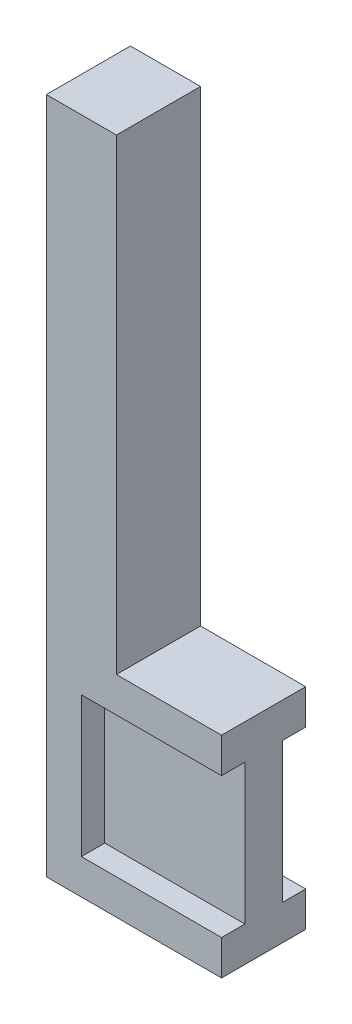
ISO-10303-21;
HEADER;
FILE_DESCRIPTION(('STEP AP214'),'2;1');
FILE_NAME('part.step','',(''),(''),'','','');
FILE_SCHEMA(('AUTOMOTIVE_DESIGN { 1 0 10303 214 1 1 1 1 }'));
ENDSEC;
DATA;
#1=APPLICATION_CONTEXT('core data for automotive mechanical design processes');
#2=APPLICATION_PROTOCOL_DEFINITION('international standard','automotive_design',2000,#1);
#3=PRODUCT_CONTEXT('',#1,'mechanical');
#4=PRODUCT('Part','Part','',(#3));
#5=PRODUCT_RELATED_PRODUCT_CATEGORY('part','',(#4));
#6=PRODUCT_DEFINITION_FORMATION('','',#4);
#7=PRODUCT_DEFINITION_CONTEXT('part definition',#1,'design');
#8=PRODUCT_DEFINITION('design','',#6,#7);
#9=PRODUCT_DEFINITION_SHAPE('','',#8);
#10=(LENGTH_UNIT() NAMED_UNIT(*) SI_UNIT(.MILLI.,.METRE.));
#11=(NAMED_UNIT(*) PLANE_ANGLE_UNIT() SI_UNIT($,.RADIAN.));
#12=(NAMED_UNIT(*) SI_UNIT($,.STERADIAN.) SOLID_ANGLE_UNIT());
#13=UNCERTAINTY_MEASURE_WITH_UNIT(LENGTH_MEASURE(1.E-05),#10,'distance_accuracy_value','');
#14=(GEOMETRIC_REPRESENTATION_CONTEXT(3) GLOBAL_UNCERTAINTY_ASSIGNED_CONTEXT((#13)) GLOBAL_UNIT_ASSIGNED_CONTEXT((#10,
#11,#12)) REPRESENTATION_CONTEXT('',''));
#15=CARTESIAN_POINT('',(0.,0.,0.));
#16=DIRECTION('',(0.,0.,1.));
#17=DIRECTION('',(1.,0.,0.));
#18=AXIS2_PLACEMENT_3D('',#15,#16,#17);
#19=CARTESIAN_POINT('',(0.,7.5,-1.));
#20=DIRECTION('',(0.,-1.,0.));
#21=DIRECTION('',(0.,0.,-1.));
#22=AXIS2_PLACEMENT_3D('',#19,#20,#21);
#23=PLANE('',#22);
#24=DIRECTION('',(0.,0.,-1.));
#25=VECTOR('',#24,1.);
#26=CARTESIAN_POINT('',(1.5,7.5,-1.));
#27=LINE('',#26,#25);
#28=CARTESIAN_POINT('',(1.5,7.5,2.6));
#29=VERTEX_POINT('',#28);
#30=CARTESIAN_POINT('',(1.5,7.5,-1.));
#31=VERTEX_POINT('',#30);
#32=EDGE_CURVE('E57',#29,#31,#27,.T.);
#33=ORIENTED_EDGE('',*,*,#32,.F.);
#34=DIRECTION('',(1.,0.,0.));
#35=VECTOR('',#34,1.);
#36=CARTESIAN_POINT('',(0.,7.5,2.6));
#37=LINE('',#36,#35);
#38=CARTESIAN_POINT('',(6.,7.5,2.6));
#39=VERTEX_POINT('',#38);
#40=EDGE_CURVE('E160',#29,#39,#37,.T.);
#41=ORIENTED_EDGE('',*,*,#40,.T.);
#42=DIRECTION('',(0.,0.,1.));
#43=VECTOR('',#42,1.);
#44=CARTESIAN_POINT('',(6.,7.5,-1.));
#45=LINE('',#44,#43);
#46=CARTESIAN_POINT('',(6.,7.5,-1.));
#47=VERTEX_POINT('',#46);
#48=EDGE_CURVE('E236',#47,#39,#45,.T.);
#49=ORIENTED_EDGE('',*,*,#48,.F.);
#50=DIRECTION('',(1.,0.,0.));
#51=VECTOR('',#50,1.);
#52=CARTESIAN_POINT('',(0.,7.5,-1.));
#53=LINE('',#52,#51);
#54=EDGE_CURVE('E208',#31,#47,#53,.T.);
#55=ORIENTED_EDGE('',*,*,#54,.F.);
#56=EDGE_LOOP('',(#33,#41,#49,#55));
#57=FACE_BOUND('',#56,.T.);
#58=ADVANCED_FACE('F40',(#57),#23,.F.);
#59=CARTESIAN_POINT('',(6.,0.,1.6));
#60=DIRECTION('',(-1.,0.,0.));
#61=DIRECTION('',(0.,0.,1.));
#62=AXIS2_PLACEMENT_3D('',#59,#60,#61);
#63=PLANE('',#62);
#64=DIRECTION('',(0.,1.,0.));
#65=VECTOR('',#64,1.);
#66=CARTESIAN_POINT('',(6.,0.,0.));
#67=LINE('',#66,#65);
#68=CARTESIAN_POINT('',(6.,0.,0.));
#69=VERTEX_POINT('',#68);
#70=CARTESIAN_POINT('',(6.,6.,0.));
#71=VERTEX_POINT('',#70);
#72=EDGE_CURVE('E249',#69,#71,#67,.T.);
#73=ORIENTED_EDGE('',*,*,#72,.T.);
#74=DIRECTION('',(0.,0.,1.));
#75=VECTOR('',#74,1.);
#76=CARTESIAN_POINT('',(6.,6.,-1.));
#77=LINE('',#76,#75);
#78=CARTESIAN_POINT('',(6.,6.,-1.));
#79=VERTEX_POINT('',#78);
#80=EDGE_CURVE('E239',#79,#71,#77,.T.);
#81=ORIENTED_EDGE('',*,*,#80,.F.);
#82=DIRECTION('',(0.,1.,0.));
#83=VECTOR('',#82,1.);
#84=CARTESIAN_POINT('',(6.,0.,-1.));
#85=LINE('',#84,#83);
#86=EDGE_CURVE('E205',#79,#47,#85,.T.);
#87=ORIENTED_EDGE('',*,*,#86,.T.);
#88=ORIENTED_EDGE('',*,*,#48,.T.);
#89=DIRECTION('',(0.,1.,0.));
#90=VECTOR('',#89,1.);
#91=CARTESIAN_POINT('',(6.,0.,2.6));
#92=LINE('',#91,#90);
#93=CARTESIAN_POINT('',(6.,6.,2.6));
#94=VERTEX_POINT('',#93);
#95=EDGE_CURVE('E188',#94,#39,#92,.T.);
#96=ORIENTED_EDGE('',*,*,#95,.F.);
#97=CARTESIAN_POINT('',(6.,6.,1.6));
#98=VERTEX_POINT('',#97);
#99=EDGE_CURVE('E220',#98,#94,#77,.T.);
#100=ORIENTED_EDGE('',*,*,#99,.F.);
#101=DIRECTION('',(0.,1.,0.));
#102=VECTOR('',#101,1.);
#103=CARTESIAN_POINT('',(6.,0.,1.6));
#104=LINE('',#103,#102);
#105=CARTESIAN_POINT('',(6.,0.,1.6));
#106=VERTEX_POINT('',#105);
#107=EDGE_CURVE('E49',#106,#98,#104,.T.);
#108=ORIENTED_EDGE('',*,*,#107,.F.);
#109=DIRECTION('',(0.,0.,1.));
#110=VECTOR('',#109,1.);
#111=CARTESIAN_POINT('',(6.,0.,-1.));
#112=LINE('',#111,#110);
#113=CARTESIAN_POINT('',(6.,0.,2.6));
#114=VERTEX_POINT('',#113);
#115=EDGE_CURVE('E232',#106,#114,#112,.T.);
#116=ORIENTED_EDGE('',*,*,#115,.T.);
#117=DIRECTION('',(0.,-1.,0.));
#118=VECTOR('',#117,1.);
#119=CARTESIAN_POINT('',(6.,0.,2.6));
#120=LINE('',#119,#118);
#121=CARTESIAN_POINT('',(6.,-1.5,2.6));
#122=VERTEX_POINT('',#121);
#123=EDGE_CURVE('E193',#114,#122,#120,.T.);
#124=ORIENTED_EDGE('',*,*,#123,.T.);
#125=DIRECTION('',(0.,0.,1.));
#126=VECTOR('',#125,1.);
#127=CARTESIAN_POINT('',(6.,-1.5,-1.));
#128=LINE('',#127,#126);
#129=CARTESIAN_POINT('',(6.,-1.5,-1.));
#130=VERTEX_POINT('',#129);
#131=EDGE_CURVE('E233',#130,#122,#128,.T.);
#132=ORIENTED_EDGE('',*,*,#131,.F.);
#133=DIRECTION('',(0.,-1.,0.));
#134=VECTOR('',#133,1.);
#135=CARTESIAN_POINT('',(6.,0.,-1.));
#136=LINE('',#135,#134);
#137=CARTESIAN_POINT('',(6.,0.,-1.));
#138=VERTEX_POINT('',#137);
#139=EDGE_CURVE('E214',#138,#130,#136,.T.);
#140=ORIENTED_EDGE('',*,*,#139,.F.);
#141=EDGE_CURVE('E229',#138,#69,#112,.T.);
#142=ORIENTED_EDGE('',*,*,#141,.T.);
#143=EDGE_LOOP('',(#73,#81,#87,#88,#96,#100,#108,#116,#124,#132,#140,#142));
#144=FACE_BOUND('',#143,.T.);
#145=ADVANCED_FACE('F42',(#144),#63,.F.);
#146=CARTESIAN_POINT('',(0.,0.,1.6));
#147=DIRECTION('',(0.,0.,-1.));
#148=DIRECTION('',(-1.,0.,0.));
#149=AXIS2_PLACEMENT_3D('',#146,#147,#148);
#150=PLANE('',#149);
#151=DIRECTION('',(0.,-1.,0.));
#152=VECTOR('',#151,1.);
#153=CARTESIAN_POINT('',(0.,0.,1.6));
#154=LINE('',#153,#152);
#155=CARTESIAN_POINT('',(0.,6.,1.6));
#156=VERTEX_POINT('',#155);
#157=CARTESIAN_POINT('',(0.,0.,1.6));
#158=VERTEX_POINT('',#157);
#159=EDGE_CURVE('E86',#156,#158,#154,.T.);
#160=ORIENTED_EDGE('',*,*,#159,.T.);
#161=DIRECTION('',(1.,0.,0.));
#162=VECTOR('',#161,1.);
#163=CARTESIAN_POINT('',(0.,0.,1.6));
#164=LINE('',#163,#162);
#165=EDGE_CURVE('E243',#158,#106,#164,.T.);
#166=ORIENTED_EDGE('',*,*,#165,.T.);
#167=ORIENTED_EDGE('',*,*,#107,.T.);
#168=DIRECTION('',(-1.,0.,0.));
#169=VECTOR('',#168,1.);
#170=CARTESIAN_POINT('',(0.,6.,1.6));
#171=LINE('',#170,#169);
#172=EDGE_CURVE('E11',#98,#156,#171,.T.);
#173=ORIENTED_EDGE('',*,*,#172,.T.);
#174=EDGE_LOOP('',(#160,#166,#167,#173));
#175=FACE_BOUND('',#174,.T.);
#176=ADVANCED_FACE('F295',(#175),#150,.F.);
#177=CARTESIAN_POINT('',(0.,0.,0.));
#178=DIRECTION('',(0.,0.,-1.));
#179=DIRECTION('',(-1.,0.,0.));
#180=AXIS2_PLACEMENT_3D('',#177,#178,#179);
#181=PLANE('',#180);
#182=DIRECTION('',(0.,-1.,0.));
#183=VECTOR('',#182,1.);
#184=CARTESIAN_POINT('',(0.,0.,0.));
#185=LINE('',#184,#183);
#186=CARTESIAN_POINT('',(0.,6.,0.));
#187=VERTEX_POINT('',#186);
#188=CARTESIAN_POINT('',(0.,0.,0.));
#189=VERTEX_POINT('',#188);
#190=EDGE_CURVE('E82',#187,#189,#185,.T.);
#191=ORIENTED_EDGE('',*,*,#190,.F.);
#192=DIRECTION('',(-1.,0.,0.));
#193=VECTOR('',#192,1.);
#194=CARTESIAN_POINT('',(0.,6.,0.));
#195=LINE('',#194,#193);
#196=EDGE_CURVE('E44',#71,#187,#195,.T.);
#197=ORIENTED_EDGE('',*,*,#196,.F.);
#198=ORIENTED_EDGE('',*,*,#72,.F.);
#199=DIRECTION('',(1.,0.,0.));
#200=VECTOR('',#199,1.);
#201=CARTESIAN_POINT('',(0.,0.,0.));
#202=LINE('',#201,#200);
#203=EDGE_CURVE('E247',#189,#69,#202,.T.);
#204=ORIENTED_EDGE('',*,*,#203,.F.);
#205=EDGE_LOOP('',(#191,#197,#198,#204));
#206=FACE_BOUND('',#205,.T.);
#207=ADVANCED_FACE('F286',(#206),#181,.T.);
#208=CARTESIAN_POINT('',(0.,6.,-1.));
#209=DIRECTION('',(0.,1.,0.));
#210=DIRECTION('',(0.,0.,1.));
#211=AXIS2_PLACEMENT_3D('',#208,#209,#210);
#212=PLANE('',#211);
#213=DIRECTION('',(0.,0.,1.));
#214=VECTOR('',#213,1.);
#215=CARTESIAN_POINT('',(0.,6.,-1.));
#216=LINE('',#215,#214);
#217=CARTESIAN_POINT('',(0.,6.,2.6));
#218=VERTEX_POINT('',#217);
#219=EDGE_CURVE('E224',#156,#218,#216,.T.);
#220=ORIENTED_EDGE('',*,*,#219,.F.);
#221=ORIENTED_EDGE('',*,*,#172,.F.);
#222=ORIENTED_EDGE('',*,*,#99,.T.);
#223=DIRECTION('',(-1.,0.,0.));
#224=VECTOR('',#223,1.);
#225=CARTESIAN_POINT('',(0.,6.,2.6));
#226=LINE('',#225,#224);
#227=EDGE_CURVE('E185',#94,#218,#226,.T.);
#228=ORIENTED_EDGE('',*,*,#227,.T.);
#229=EDGE_LOOP('',(#220,#221,#222,#228));
#230=FACE_BOUND('',#229,.T.);
#231=ADVANCED_FACE('F269',(#230),#212,.F.);
#232=CARTESIAN_POINT('',(0.,0.,-1.));
#233=DIRECTION('',(-1.,0.,0.));
#234=DIRECTION('',(0.,-1.,0.));
#235=AXIS2_PLACEMENT_3D('',#232,#233,#234);
#236=PLANE('',#235);
#237=DIRECTION('',(0.,0.,1.));
#238=VECTOR('',#237,1.);
#239=CARTESIAN_POINT('',(0.,0.,-1.));
#240=LINE('',#239,#238);
#241=CARTESIAN_POINT('',(0.,0.,2.6));
#242=VERTEX_POINT('',#241);
#243=EDGE_CURVE('E228',#158,#242,#240,.T.);
#244=ORIENTED_EDGE('',*,*,#243,.F.);
#245=ORIENTED_EDGE('',*,*,#159,.F.);
#246=ORIENTED_EDGE('',*,*,#219,.T.);
#247=DIRECTION('',(0.,-1.,0.));
#248=VECTOR('',#247,1.);
#249=CARTESIAN_POINT('',(0.,0.,2.6));
#250=LINE('',#249,#248);
#251=EDGE_CURVE('E199',#218,#242,#250,.T.);
#252=ORIENTED_EDGE('',*,*,#251,.T.);
#253=EDGE_LOOP('',(#244,#245,#246,#252));
#254=FACE_BOUND('',#253,.T.);
#255=ADVANCED_FACE('F277',(#254),#236,.F.);
#256=CARTESIAN_POINT('',(0.,0.,-1.));
#257=DIRECTION('',(0.,-1.,0.));
#258=DIRECTION('',(0.,0.,-1.));
#259=AXIS2_PLACEMENT_3D('',#256,#257,#258);
#260=PLANE('',#259);
#261=ORIENTED_EDGE('',*,*,#115,.F.);
#262=ORIENTED_EDGE('',*,*,#165,.F.);
#263=ORIENTED_EDGE('',*,*,#243,.T.);
#264=DIRECTION('',(1.,0.,0.));
#265=VECTOR('',#264,1.);
#266=CARTESIAN_POINT('',(0.,0.,2.6));
#267=LINE('',#266,#265);
#268=EDGE_CURVE('E196',#242,#114,#267,.T.);
#269=ORIENTED_EDGE('',*,*,#268,.T.);
#270=EDGE_LOOP('',(#261,#262,#263,#269));
#271=FACE_BOUND('',#270,.T.);
#272=ADVANCED_FACE('F274',(#271),#260,.F.);
#273=ORIENTED_EDGE('',*,*,#196,.T.);
#274=CARTESIAN_POINT('',(0.,6.,-1.));
#275=VERTEX_POINT('',#274);
#276=EDGE_CURVE('E221',#275,#187,#216,.T.);
#277=ORIENTED_EDGE('',*,*,#276,.F.);
#278=DIRECTION('',(-1.,0.,0.));
#279=VECTOR('',#278,1.);
#280=CARTESIAN_POINT('',(0.,6.,-1.));
#281=LINE('',#280,#279);
#282=EDGE_CURVE('E202',#79,#275,#281,.T.);
#283=ORIENTED_EDGE('',*,*,#282,.F.);
#284=ORIENTED_EDGE('',*,*,#80,.T.);
#285=EDGE_LOOP('',(#273,#277,#283,#284));
#286=FACE_BOUND('',#285,.T.);
#287=ADVANCED_FACE('F253',(#286),#212,.F.);
#288=ORIENTED_EDGE('',*,*,#190,.T.);
#289=CARTESIAN_POINT('',(0.,0.,-1.));
#290=VERTEX_POINT('',#289);
#291=EDGE_CURVE('E225',#290,#189,#240,.T.);
#292=ORIENTED_EDGE('',*,*,#291,.F.);
#293=DIRECTION('',(0.,-1.,0.));
#294=VECTOR('',#293,1.);
#295=CARTESIAN_POINT('',(0.,0.,-1.));
#296=LINE('',#295,#294);
#297=EDGE_CURVE('E218',#275,#290,#296,.T.);
#298=ORIENTED_EDGE('',*,*,#297,.F.);
#299=ORIENTED_EDGE('',*,*,#276,.T.);
#300=EDGE_LOOP('',(#288,#292,#298,#299));
#301=FACE_BOUND('',#300,.T.);
#302=ADVANCED_FACE('F256',(#301),#236,.F.);
#303=ORIENTED_EDGE('',*,*,#203,.T.);
#304=ORIENTED_EDGE('',*,*,#141,.F.);
#305=DIRECTION('',(1.,0.,0.));
#306=VECTOR('',#305,1.);
#307=CARTESIAN_POINT('',(0.,0.,-1.));
#308=LINE('',#307,#306);
#309=EDGE_CURVE('E216',#290,#138,#308,.T.);
#310=ORIENTED_EDGE('',*,*,#309,.F.);
#311=ORIENTED_EDGE('',*,*,#291,.T.);
#312=EDGE_LOOP('',(#303,#304,#310,#311));
#313=FACE_BOUND('',#312,.T.);
#314=ADVANCED_FACE('F285',(#313),#260,.F.);
#315=CARTESIAN_POINT('',(0.,-1.5,-1.));
#316=DIRECTION('',(0.,1.,0.));
#317=DIRECTION('',(-1.,0.,0.));
#318=AXIS2_PLACEMENT_3D('',#315,#316,#317);
#319=PLANE('',#318);
#320=ORIENTED_EDGE('',*,*,#131,.T.);
#321=DIRECTION('',(-1.,0.,0.));
#322=VECTOR('',#321,1.);
#323=CARTESIAN_POINT('',(0.,-1.5,2.6));
#324=LINE('',#323,#322);
#325=CARTESIAN_POINT('',(-1.5,-1.5,2.6));
#326=VERTEX_POINT('',#325);
#327=EDGE_CURVE('E159',#122,#326,#324,.T.);
#328=ORIENTED_EDGE('',*,*,#327,.T.);
#329=DIRECTION('',(0.,0.,1.));
#330=VECTOR('',#329,1.);
#331=CARTESIAN_POINT('',(-1.5,-1.5,-1.));
#332=LINE('',#331,#330);
#333=CARTESIAN_POINT('',(-1.5,-1.5,-1.));
#334=VERTEX_POINT('',#333);
#335=EDGE_CURVE('E155',#334,#326,#332,.T.);
#336=ORIENTED_EDGE('',*,*,#335,.F.);
#337=DIRECTION('',(-1.,0.,0.));
#338=VECTOR('',#337,1.);
#339=CARTESIAN_POINT('',(0.,-1.5,-1.));
#340=LINE('',#339,#338);
#341=EDGE_CURVE('E212',#130,#334,#340,.T.);
#342=ORIENTED_EDGE('',*,*,#341,.F.);
#343=EDGE_LOOP('',(#320,#328,#336,#342));
#344=FACE_BOUND('',#343,.T.);
#345=ADVANCED_FACE('F349',(#344),#319,.F.);
#346=CARTESIAN_POINT('',(-1.5,0.,-1.));
#347=DIRECTION('',(-1.,0.,0.));
#348=DIRECTION('',(0.,-1.,0.));
#349=AXIS2_PLACEMENT_3D('',#346,#347,#348);
#350=PLANE('',#349);
#351=ORIENTED_EDGE('',*,*,#335,.T.);
#352=DIRECTION('',(0.,-1.,0.));
#353=VECTOR('',#352,1.);
#354=CARTESIAN_POINT('',(-1.5,0.,2.6));
#355=LINE('',#354,#353);
#356=CARTESIAN_POINT('',(-1.5,27.5,2.6));
#357=VERTEX_POINT('',#356);
#358=EDGE_CURVE('E148',#357,#326,#355,.T.);
#359=ORIENTED_EDGE('',*,*,#358,.F.);
#360=DIRECTION('',(0.,0.,1.));
#361=VECTOR('',#360,1.);
#362=CARTESIAN_POINT('',(-1.5,27.5,-1.));
#363=LINE('',#362,#361);
#364=CARTESIAN_POINT('',(-1.5,27.5,-1.));
#365=VERTEX_POINT('',#364);
#366=EDGE_CURVE('E153',#365,#357,#363,.T.);
#367=ORIENTED_EDGE('',*,*,#366,.F.);
#368=DIRECTION('',(0.,-1.,0.));
#369=VECTOR('',#368,1.);
#370=CARTESIAN_POINT('',(-1.5,0.,-1.));
#371=LINE('',#370,#369);
#372=EDGE_CURVE('E210',#365,#334,#371,.T.);
#373=ORIENTED_EDGE('',*,*,#372,.T.);
#374=EDGE_LOOP('',(#351,#359,#367,#373));
#375=FACE_BOUND('',#374,.T.);
#376=ADVANCED_FACE('F150',(#375),#350,.T.);
#377=CARTESIAN_POINT('',(0.,0.,-1.));
#378=DIRECTION('',(0.,0.,1.));
#379=DIRECTION('',(1.,0.,0.));
#380=AXIS2_PLACEMENT_3D('',#377,#378,#379);
#381=PLANE('',#380);
#382=ORIENTED_EDGE('',*,*,#282,.T.);
#383=ORIENTED_EDGE('',*,*,#297,.T.);
#384=ORIENTED_EDGE('',*,*,#309,.T.);
#385=ORIENTED_EDGE('',*,*,#139,.T.);
#386=ORIENTED_EDGE('',*,*,#341,.T.);
#387=ORIENTED_EDGE('',*,*,#372,.F.);
#388=DIRECTION('',(-1.,0.,0.));
#389=VECTOR('',#388,1.);
#390=CARTESIAN_POINT('',(-1.5,27.5,-1.));
#391=LINE('',#390,#389);
#392=CARTESIAN_POINT('',(1.5,27.5,-1.));
#393=VERTEX_POINT('',#392);
#394=EDGE_CURVE('E175',#393,#365,#391,.T.);
#395=ORIENTED_EDGE('',*,*,#394,.F.);
#396=DIRECTION('',(0.,-1.,0.));
#397=VECTOR('',#396,1.);
#398=CARTESIAN_POINT('',(1.5,27.5,-1.));
#399=LINE('',#398,#397);
#400=EDGE_CURVE('E180',#393,#31,#399,.T.);
#401=ORIENTED_EDGE('',*,*,#400,.T.);
#402=ORIENTED_EDGE('',*,*,#54,.T.);
#403=ORIENTED_EDGE('',*,*,#86,.F.);
#404=EDGE_LOOP('',(#382,#383,#384,#385,#386,#387,#395,#401,#402,#403));
#405=FACE_BOUND('',#404,.T.);
#406=ADVANCED_FACE('F261',(#405),#381,.F.);
#407=CARTESIAN_POINT('',(0.,0.,2.6));
#408=DIRECTION('',(0.,0.,1.));
#409=DIRECTION('',(1.,0.,0.));
#410=AXIS2_PLACEMENT_3D('',#407,#408,#409);
#411=PLANE('',#410);
#412=ORIENTED_EDGE('',*,*,#227,.F.);
#413=ORIENTED_EDGE('',*,*,#95,.T.);
#414=ORIENTED_EDGE('',*,*,#40,.F.);
#415=DIRECTION('',(0.,-1.,0.));
#416=VECTOR('',#415,1.);
#417=CARTESIAN_POINT('',(1.5,27.5,2.6));
#418=LINE('',#417,#416);
#419=CARTESIAN_POINT('',(1.5,27.5,2.6));
#420=VERTEX_POINT('',#419);
#421=EDGE_CURVE('E167',#420,#29,#418,.T.);
#422=ORIENTED_EDGE('',*,*,#421,.F.);
#423=DIRECTION('',(1.,0.,0.));
#424=VECTOR('',#423,1.);
#425=CARTESIAN_POINT('',(-1.5,27.5,2.6));
#426=LINE('',#425,#424);
#427=EDGE_CURVE('E163',#357,#420,#426,.T.);
#428=ORIENTED_EDGE('',*,*,#427,.F.);
#429=ORIENTED_EDGE('',*,*,#358,.T.);
#430=ORIENTED_EDGE('',*,*,#327,.F.);
#431=ORIENTED_EDGE('',*,*,#123,.F.);
#432=ORIENTED_EDGE('',*,*,#268,.F.);
#433=ORIENTED_EDGE('',*,*,#251,.F.);
#434=EDGE_LOOP('',(#412,#413,#414,#422,#428,#429,#430,#431,#432,#433));
#435=FACE_BOUND('',#434,.T.);
#436=ADVANCED_FACE('F165',(#435),#411,.T.);
#437=CARTESIAN_POINT('',(1.5,27.5,-1.));
#438=DIRECTION('',(-1.,0.,0.));
#439=DIRECTION('',(0.,0.,1.));
#440=AXIS2_PLACEMENT_3D('',#437,#438,#439);
#441=PLANE('',#440);
#442=ORIENTED_EDGE('',*,*,#32,.T.);
#443=ORIENTED_EDGE('',*,*,#400,.F.);
#444=DIRECTION('',(0.,0.,-1.));
#445=VECTOR('',#444,1.);
#446=CARTESIAN_POINT('',(1.5,27.5,-1.));
#447=LINE('',#446,#445);
#448=EDGE_CURVE('E170',#420,#393,#447,.T.);
#449=ORIENTED_EDGE('',*,*,#448,.F.);
#450=ORIENTED_EDGE('',*,*,#421,.T.);
#451=EDGE_LOOP('',(#442,#443,#449,#450));
#452=FACE_BOUND('',#451,.T.);
#453=ADVANCED_FACE('F389',(#452),#441,.F.);
#454=CARTESIAN_POINT('',(0.,27.5,0.));
#455=DIRECTION('',(0.,1.,0.));
#456=DIRECTION('',(0.,0.,1.));
#457=AXIS2_PLACEMENT_3D('',#454,#455,#456);
#458=PLANE('',#457);
#459=ORIENTED_EDGE('',*,*,#366,.T.);
#460=ORIENTED_EDGE('',*,*,#427,.T.);
#461=ORIENTED_EDGE('',*,*,#448,.T.);
#462=ORIENTED_EDGE('',*,*,#394,.T.);
#463=EDGE_LOOP('',(#459,#460,#461,#462));
#464=FACE_BOUND('',#463,.T.);
#465=ADVANCED_FACE('F173',(#464),#458,.T.);
#466=CLOSED_SHELL('',(#58,#145,#176,#207,#231,#255,#272,#287,#302,#314,#345,#376,#406,#436,#453,#465));
#467=MANIFOLD_SOLID_BREP('B2',#466);
#468=ADVANCED_BREP_SHAPE_REPRESENTATION('',(#18,#467),#14);
#469=SHAPE_DEFINITION_REPRESENTATION(#9,#468);
ENDSEC;
END-ISO-10303-21;
